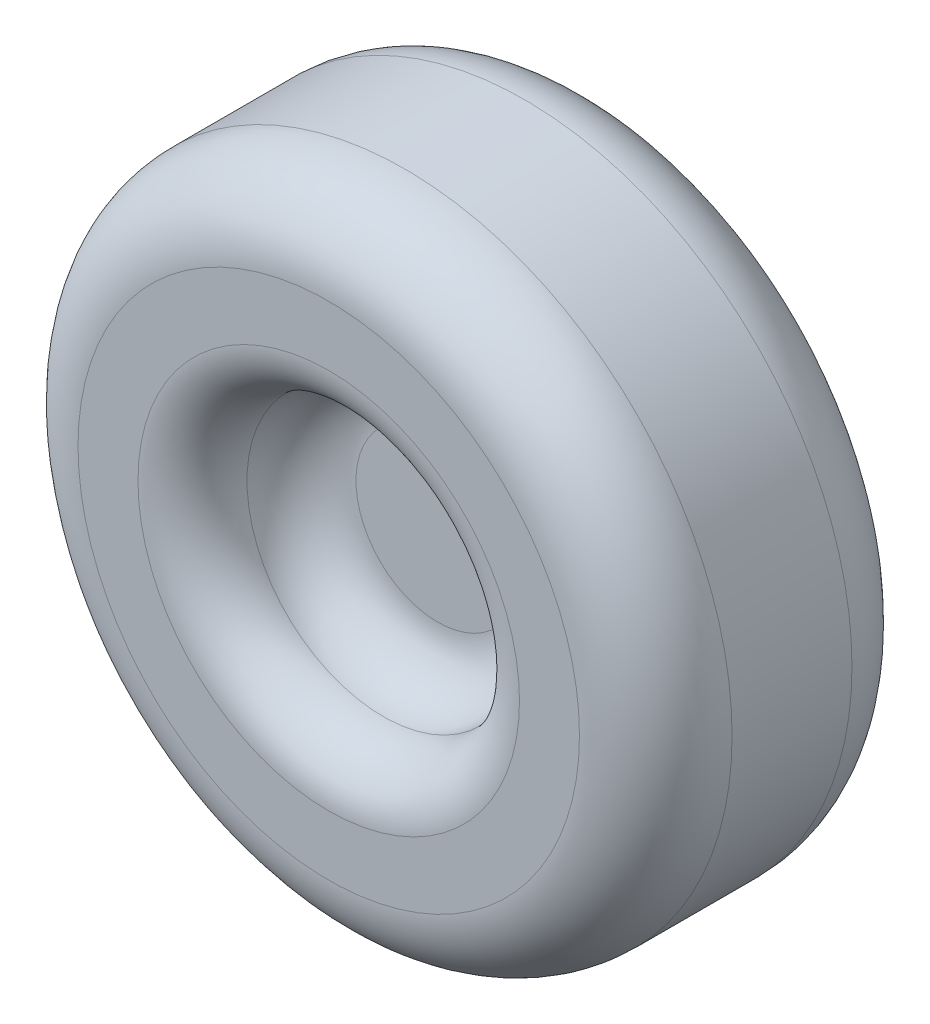
ISO-10303-21;
HEADER;
FILE_DESCRIPTION(('STEP AP214'),'2;1');
FILE_NAME('part.step','',(''),(''),'','','');
FILE_SCHEMA(('AUTOMOTIVE_DESIGN { 1 0 10303 214 1 1 1 1 }'));
ENDSEC;
DATA;
#1=APPLICATION_CONTEXT('core data for automotive mechanical design processes');
#2=APPLICATION_PROTOCOL_DEFINITION('international standard','automotive_design',2000,#1);
#3=PRODUCT_CONTEXT('',#1,'mechanical');
#4=PRODUCT('Part','Part','',(#3));
#5=PRODUCT_RELATED_PRODUCT_CATEGORY('part','',(#4));
#6=PRODUCT_DEFINITION_FORMATION('','',#4);
#7=PRODUCT_DEFINITION_CONTEXT('part definition',#1,'design');
#8=PRODUCT_DEFINITION('design','',#6,#7);
#9=PRODUCT_DEFINITION_SHAPE('','',#8);
#10=(LENGTH_UNIT() NAMED_UNIT(*) SI_UNIT(.MILLI.,.METRE.));
#11=(NAMED_UNIT(*) PLANE_ANGLE_UNIT() SI_UNIT($,.RADIAN.));
#12=(NAMED_UNIT(*) SI_UNIT($,.STERADIAN.) SOLID_ANGLE_UNIT());
#13=UNCERTAINTY_MEASURE_WITH_UNIT(LENGTH_MEASURE(1.E-05),#10,'distance_accuracy_value','');
#14=(GEOMETRIC_REPRESENTATION_CONTEXT(3) GLOBAL_UNCERTAINTY_ASSIGNED_CONTEXT((#13)) GLOBAL_UNIT_ASSIGNED_CONTEXT((#10,
#11,#12)) REPRESENTATION_CONTEXT('',''));
#15=CARTESIAN_POINT('',(0.,0.,0.));
#16=DIRECTION('',(0.,0.,1.));
#17=DIRECTION('',(1.,0.,0.));
#18=AXIS2_PLACEMENT_3D('',#15,#16,#17);
#19=CARTESIAN_POINT('',(0.,0.,25.));
#20=DIRECTION('',(0.,0.,-1.));
#21=DIRECTION('',(-1.,0.,0.));
#22=AXIS2_PLACEMENT_3D('',#19,#20,#21);
#23=CYLINDRICAL_SURFACE('',#22,30.);
#24=CARTESIAN_POINT('',(0.,0.,18.));
#25=DIRECTION('',(0.,0.,1.));
#26=DIRECTION('',(1.,0.,0.));
#27=AXIS2_PLACEMENT_3D('',#24,#25,#26);
#28=CIRCLE('',#27,30.);
#29=CARTESIAN_POINT('',(30.,0.,18.));
#30=VERTEX_POINT('',#29);
#31=EDGE_CURVE('E45',#30,#30,#28,.F.);
#32=ORIENTED_EDGE('',*,*,#31,.T.);
#33=EDGE_LOOP('',(#32));
#34=FACE_BOUND('',#33,.T.);
#35=CARTESIAN_POINT('',(0.,0.,7.));
#36=DIRECTION('',(0.,0.,1.));
#37=DIRECTION('',(1.,0.,0.));
#38=AXIS2_PLACEMENT_3D('',#35,#36,#37);
#39=CIRCLE('',#38,30.);
#40=CARTESIAN_POINT('',(30.,0.,7.));
#41=VERTEX_POINT('',#40);
#42=EDGE_CURVE('E50',#41,#41,#39,.T.);
#43=ORIENTED_EDGE('',*,*,#42,.T.);
#44=EDGE_LOOP('',(#43));
#45=FACE_BOUND('',#44,.T.);
#46=ADVANCED_FACE('F37',(#34,#45),#23,.T.);
#47=CARTESIAN_POINT('',(0.,0.,25.));
#48=DIRECTION('',(0.,0.,1.));
#49=DIRECTION('',(1.,0.,0.));
#50=AXIS2_PLACEMENT_3D('',#47,#48,#49);
#51=PLANE('',#50);
#52=CARTESIAN_POINT('',(0.,0.,25.));
#53=DIRECTION('',(0.,0.,1.));
#54=DIRECTION('',(1.,0.,0.));
#55=AXIS2_PLACEMENT_3D('',#52,#53,#54);
#56=CIRCLE('',#55,23.);
#57=CARTESIAN_POINT('',(23.,0.,25.));
#58=VERTEX_POINT('',#57);
#59=EDGE_CURVE('E55',#58,#58,#56,.T.);
#60=ORIENTED_EDGE('',*,*,#59,.T.);
#61=EDGE_LOOP('',(#60));
#62=FACE_BOUND('',#61,.T.);
#63=CARTESIAN_POINT('',(0.,0.,25.));
#64=DIRECTION('',(0.,0.,1.));
#65=DIRECTION('',(1.,0.,0.));
#66=AXIS2_PLACEMENT_3D('',#63,#64,#65);
#67=CIRCLE('',#66,17.5);
#68=CARTESIAN_POINT('',(17.5,0.,25.));
#69=VERTEX_POINT('',#68);
#70=EDGE_CURVE('E61',#69,#69,#67,.F.);
#71=ORIENTED_EDGE('',*,*,#70,.T.);
#72=EDGE_LOOP('',(#71));
#73=FACE_BOUND('',#72,.T.);
#74=ADVANCED_FACE('F91',(#62,#73),#51,.T.);
#75=CARTESIAN_POINT('',(0.,0.,0.));
#76=DIRECTION('',(0.,0.,1.));
#77=DIRECTION('',(1.,0.,0.));
#78=AXIS2_PLACEMENT_3D('',#75,#76,#77);
#79=PLANE('',#78);
#80=CARTESIAN_POINT('',(0.,0.,0.));
#81=DIRECTION('',(0.,0.,1.));
#82=DIRECTION('',(1.,0.,0.));
#83=AXIS2_PLACEMENT_3D('',#80,#81,#82);
#84=CIRCLE('',#83,23.);
#85=CARTESIAN_POINT('',(23.,0.,0.));
#86=VERTEX_POINT('',#85);
#87=EDGE_CURVE('E10',#86,#86,#84,.F.);
#88=ORIENTED_EDGE('',*,*,#87,.T.);
#89=EDGE_LOOP('',(#88));
#90=FACE_BOUND('',#89,.T.);
#91=ADVANCED_FACE('F95',(#90),#79,.F.);
#92=CARTESIAN_POINT('',(0.,0.,15.));
#93=DIRECTION('',(0.,0.,1.));
#94=DIRECTION('',(1.,0.,0.));
#95=AXIS2_PLACEMENT_3D('',#92,#93,#94);
#96=PLANE('',#95);
#97=CARTESIAN_POINT('',(0.,0.,15.));
#98=DIRECTION('',(0.,0.,1.));
#99=DIRECTION('',(1.,0.,0.));
#100=AXIS2_PLACEMENT_3D('',#97,#98,#99);
#101=CIRCLE('',#100,7.5);
#102=CARTESIAN_POINT('',(7.5,0.,15.));
#103=VERTEX_POINT('',#102);
#104=EDGE_CURVE('E66',#103,#103,#101,.T.);
#105=ORIENTED_EDGE('',*,*,#104,.T.);
#106=EDGE_LOOP('',(#105));
#107=FACE_BOUND('',#106,.T.);
#108=ADVANCED_FACE('F74',(#107),#96,.T.);
#109=CARTESIAN_POINT('',(0.,0.,20.));
#110=DIRECTION('',(0.,0.,1.));
#111=DIRECTION('',(1.,0.,0.));
#112=AXIS2_PLACEMENT_3D('',#109,#110,#111);
#113=TOROIDAL_SURFACE('',#112,17.5,5.);
#114=ORIENTED_EDGE('',*,*,#70,.F.);
#115=EDGE_LOOP('',(#114));
#116=FACE_BOUND('',#115,.T.);
#117=CARTESIAN_POINT('',(0.,0.,20.));
#118=DIRECTION('',(0.,0.,1.));
#119=DIRECTION('',(1.,0.,0.));
#120=AXIS2_PLACEMENT_3D('',#117,#118,#119);
#121=CIRCLE('',#120,12.5);
#122=CARTESIAN_POINT('',(12.5,0.,20.));
#123=VERTEX_POINT('',#122);
#124=EDGE_CURVE('E62',#123,#123,#121,.T.);
#125=ORIENTED_EDGE('',*,*,#124,.F.);
#126=EDGE_LOOP('',(#125));
#127=FACE_BOUND('',#126,.T.);
#128=ADVANCED_FACE('F79',(#116,#127),#113,.T.);
#129=CARTESIAN_POINT('',(0.,0.,20.));
#130=DIRECTION('',(0.,0.,1.));
#131=DIRECTION('',(1.,0.,0.));
#132=AXIS2_PLACEMENT_3D('',#129,#130,#131);
#133=TOROIDAL_SURFACE('',#132,7.5,5.);
#134=ORIENTED_EDGE('',*,*,#124,.T.);
#135=EDGE_LOOP('',(#134));
#136=FACE_BOUND('',#135,.T.);
#137=ORIENTED_EDGE('',*,*,#104,.F.);
#138=EDGE_LOOP('',(#137));
#139=FACE_BOUND('',#138,.T.);
#140=ADVANCED_FACE('F76',(#136,#139),#133,.F.);
#141=CARTESIAN_POINT('',(0.,0.,18.));
#142=DIRECTION('',(0.,0.,1.));
#143=DIRECTION('',(1.,0.,0.));
#144=AXIS2_PLACEMENT_3D('',#141,#142,#143);
#145=TOROIDAL_SURFACE('',#144,23.,7.);
#146=ORIENTED_EDGE('',*,*,#31,.F.);
#147=EDGE_LOOP('',(#146));
#148=FACE_BOUND('',#147,.T.);
#149=ORIENTED_EDGE('',*,*,#59,.F.);
#150=EDGE_LOOP('',(#149));
#151=FACE_BOUND('',#150,.T.);
#152=ADVANCED_FACE('F78',(#148,#151),#145,.T.);
#153=CARTESIAN_POINT('',(0.,0.,7.));
#154=DIRECTION('',(0.,0.,1.));
#155=DIRECTION('',(1.,0.,0.));
#156=AXIS2_PLACEMENT_3D('',#153,#154,#155);
#157=TOROIDAL_SURFACE('',#156,23.,7.);
#158=ORIENTED_EDGE('',*,*,#87,.F.);
#159=EDGE_LOOP('',(#158));
#160=FACE_BOUND('',#159,.T.);
#161=ORIENTED_EDGE('',*,*,#42,.F.);
#162=EDGE_LOOP('',(#161));
#163=FACE_BOUND('',#162,.T.);
#164=ADVANCED_FACE('F39',(#160,#163),#157,.T.);
#165=CLOSED_SHELL('',(#46,#74,#91,#108,#128,#140,#152,#164));
#166=MANIFOLD_SOLID_BREP('B2',#165);
#167=ADVANCED_BREP_SHAPE_REPRESENTATION('',(#18,#166),#14);
#168=SHAPE_DEFINITION_REPRESENTATION(#9,#167);
ENDSEC;
END-ISO-10303-21;
